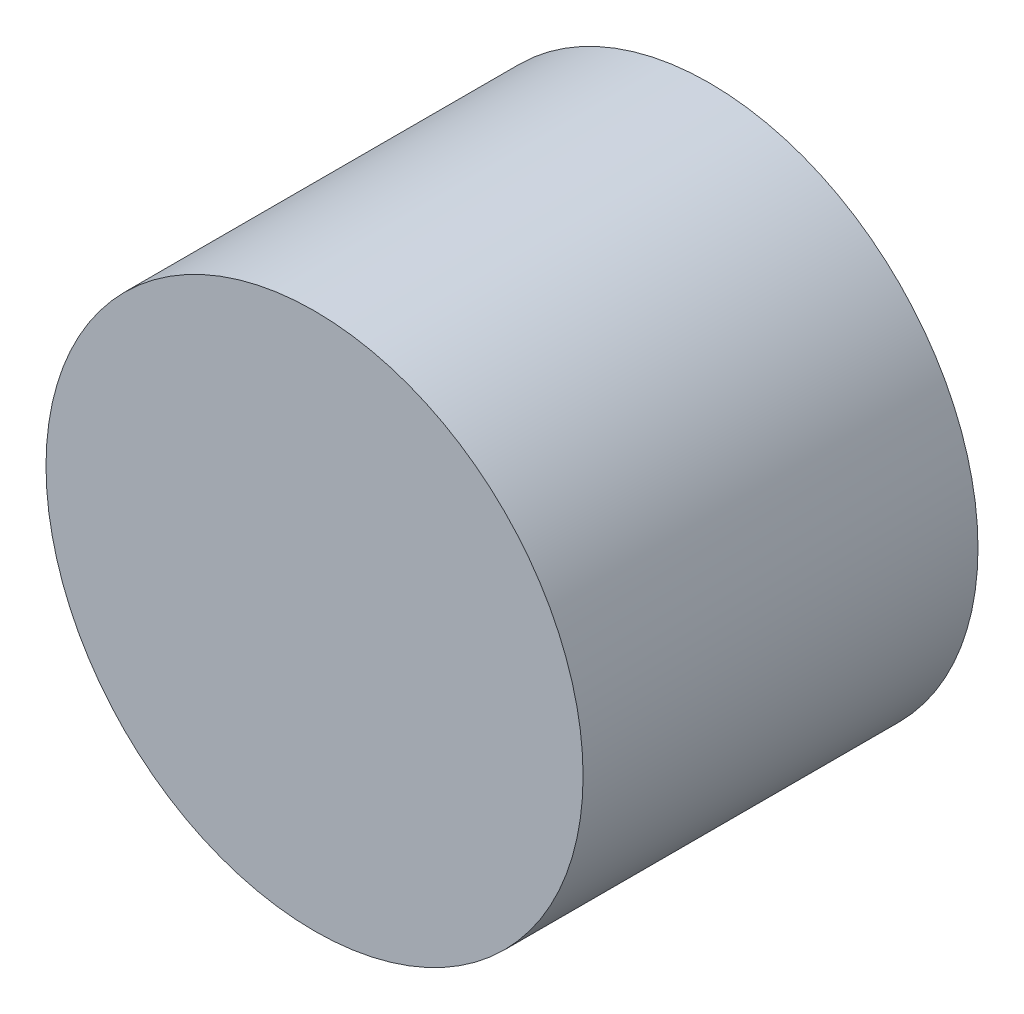
ISO-10303-21;
HEADER;
FILE_DESCRIPTION(('STEP AP214'),'2;1');
FILE_NAME('part.step','',(''),(''),'','','');
FILE_SCHEMA(('AUTOMOTIVE_DESIGN { 1 0 10303 214 1 1 1 1 }'));
ENDSEC;
DATA;
#1=APPLICATION_CONTEXT('core data for automotive mechanical design processes');
#2=APPLICATION_PROTOCOL_DEFINITION('international standard','automotive_design',2000,#1);
#3=PRODUCT_CONTEXT('',#1,'mechanical');
#4=PRODUCT('Part','Part','',(#3));
#5=PRODUCT_RELATED_PRODUCT_CATEGORY('part','',(#4));
#6=PRODUCT_DEFINITION_FORMATION('','',#4);
#7=PRODUCT_DEFINITION_CONTEXT('part definition',#1,'design');
#8=PRODUCT_DEFINITION('design','',#6,#7);
#9=PRODUCT_DEFINITION_SHAPE('','',#8);
#10=(LENGTH_UNIT() NAMED_UNIT(*) SI_UNIT(.MILLI.,.METRE.));
#11=(NAMED_UNIT(*) PLANE_ANGLE_UNIT() SI_UNIT($,.RADIAN.));
#12=(NAMED_UNIT(*) SI_UNIT($,.STERADIAN.) SOLID_ANGLE_UNIT());
#13=UNCERTAINTY_MEASURE_WITH_UNIT(LENGTH_MEASURE(1.E-05),#10,'distance_accuracy_value','');
#14=(GEOMETRIC_REPRESENTATION_CONTEXT(3) GLOBAL_UNCERTAINTY_ASSIGNED_CONTEXT((#13)) GLOBAL_UNIT_ASSIGNED_CONTEXT((#10,
#11,#12)) REPRESENTATION_CONTEXT('',''));
#15=CARTESIAN_POINT('',(0.,0.,0.));
#16=DIRECTION('',(0.,0.,1.));
#17=DIRECTION('',(1.,0.,0.));
#18=AXIS2_PLACEMENT_3D('',#15,#16,#17);
#19=CARTESIAN_POINT('',(0.,0.,12.5));
#20=DIRECTION('',(0.,0.,-1.));
#21=DIRECTION('',(-1.,0.,0.));
#22=AXIS2_PLACEMENT_3D('',#19,#20,#21);
#23=CYLINDRICAL_SURFACE('',#22,8.5);
#24=CARTESIAN_POINT('',(0.,0.,12.5));
#25=DIRECTION('',(0.,0.,1.));
#26=DIRECTION('',(1.,0.,0.));
#27=AXIS2_PLACEMENT_3D('',#24,#25,#26);
#28=CIRCLE('',#27,8.5);
#29=CARTESIAN_POINT('',(8.5,0.,12.5));
#30=VERTEX_POINT('',#29);
#31=EDGE_CURVE('E10',#30,#30,#28,.T.);
#32=ORIENTED_EDGE('',*,*,#31,.F.);
#33=EDGE_LOOP('',(#32));
#34=FACE_BOUND('',#33,.T.);
#35=CARTESIAN_POINT('',(0.,0.,0.));
#36=DIRECTION('',(0.,0.,1.));
#37=DIRECTION('',(1.,0.,0.));
#38=AXIS2_PLACEMENT_3D('',#35,#36,#37);
#39=CIRCLE('',#38,8.5);
#40=CARTESIAN_POINT('',(8.5,0.,0.));
#41=VERTEX_POINT('',#40);
#42=EDGE_CURVE('E46',#41,#41,#39,.T.);
#43=ORIENTED_EDGE('',*,*,#42,.T.);
#44=EDGE_LOOP('',(#43));
#45=FACE_BOUND('',#44,.T.);
#46=ADVANCED_FACE('F43',(#34,#45),#23,.T.);
#47=CARTESIAN_POINT('',(0.,0.,12.5));
#48=DIRECTION('',(0.,0.,1.));
#49=DIRECTION('',(1.,0.,0.));
#50=AXIS2_PLACEMENT_3D('',#47,#48,#49);
#51=PLANE('',#50);
#52=ORIENTED_EDGE('',*,*,#31,.T.);
#53=EDGE_LOOP('',(#52));
#54=FACE_BOUND('',#53,.T.);
#55=ADVANCED_FACE('F60',(#54),#51,.T.);
#56=CARTESIAN_POINT('',(0.,0.,0.));
#57=DIRECTION('',(0.,0.,1.));
#58=DIRECTION('',(1.,0.,0.));
#59=AXIS2_PLACEMENT_3D('',#56,#57,#58);
#60=PLANE('',#59);
#61=ORIENTED_EDGE('',*,*,#42,.F.);
#62=EDGE_LOOP('',(#61));
#63=FACE_BOUND('',#62,.T.);
#64=ADVANCED_FACE('F58',(#63),#60,.F.);
#65=CLOSED_SHELL('',(#46,#55,#64));
#66=MANIFOLD_SOLID_BREP('B2',#65);
#67=ADVANCED_BREP_SHAPE_REPRESENTATION('',(#18,#66),#14);
#68=SHAPE_DEFINITION_REPRESENTATION(#9,#67);
ENDSEC;
END-ISO-10303-21;
